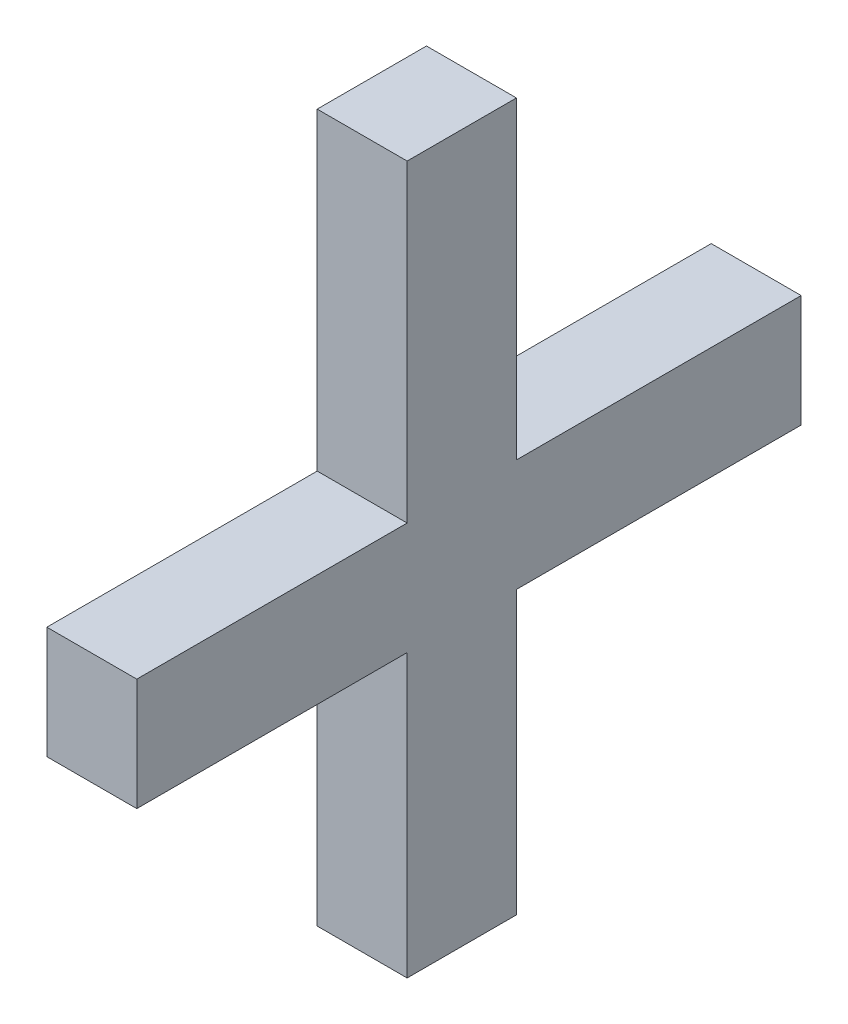
ISO-10303-21;
HEADER;
FILE_DESCRIPTION(('STEP AP214'),'2;1');
FILE_NAME('part.step','',(''),(''),'','','');
FILE_SCHEMA(('AUTOMOTIVE_DESIGN { 1 0 10303 214 1 1 1 1 }'));
ENDSEC;
DATA;
#1=APPLICATION_CONTEXT('core data for automotive mechanical design processes');
#2=APPLICATION_PROTOCOL_DEFINITION('international standard','automotive_design',2000,#1);
#3=PRODUCT_CONTEXT('',#1,'mechanical');
#4=PRODUCT('Part','Part','',(#3));
#5=PRODUCT_RELATED_PRODUCT_CATEGORY('part','',(#4));
#6=PRODUCT_DEFINITION_FORMATION('','',#4);
#7=PRODUCT_DEFINITION_CONTEXT('part definition',#1,'design');
#8=PRODUCT_DEFINITION('design','',#6,#7);
#9=PRODUCT_DEFINITION_SHAPE('','',#8);
#10=(LENGTH_UNIT() NAMED_UNIT(*) SI_UNIT(.MILLI.,.METRE.));
#11=(NAMED_UNIT(*) PLANE_ANGLE_UNIT() SI_UNIT($,.RADIAN.));
#12=(NAMED_UNIT(*) SI_UNIT($,.STERADIAN.) SOLID_ANGLE_UNIT());
#13=UNCERTAINTY_MEASURE_WITH_UNIT(LENGTH_MEASURE(1.E-05),#10,'distance_accuracy_value','');
#14=(GEOMETRIC_REPRESENTATION_CONTEXT(3) GLOBAL_UNCERTAINTY_ASSIGNED_CONTEXT((#13)) GLOBAL_UNIT_ASSIGNED_CONTEXT((#10,
#11,#12)) REPRESENTATION_CONTEXT('',''));
#15=CARTESIAN_POINT('',(0.,0.,0.));
#16=DIRECTION('',(0.,0.,1.));
#17=DIRECTION('',(1.,0.,0.));
#18=AXIS2_PLACEMENT_3D('',#15,#16,#17);
#19=CARTESIAN_POINT('',(20.25,12.25,-20.25));
#20=DIRECTION('',(-1.,0.,0.));
#21=DIRECTION('',(0.,0.,1.));
#22=AXIS2_PLACEMENT_3D('',#19,#20,#21);
#23=PLANE('',#22);
#24=DIRECTION('',(0.,0.,1.));
#25=VECTOR('',#24,1.);
#26=CARTESIAN_POINT('',(20.25,14.1090192240258,0.));
#27=LINE('',#26,#25);
#28=CARTESIAN_POINT('',(20.25,14.1090192240258,-18.0636481272001));
#29=VERTEX_POINT('',#28);
#30=CARTESIAN_POINT('',(20.25,14.1090192240258,-17.3123076946756));
#31=VERTEX_POINT('',#30);
#32=EDGE_CURVE('E242',#29,#31,#27,.T.);
#33=ORIENTED_EDGE('',*,*,#32,.T.);
#34=DIRECTION('',(0.,-1.,0.));
#35=VECTOR('',#34,1.);
#36=CARTESIAN_POINT('',(20.25,22.05,-17.3123076946756));
#37=LINE('',#36,#35);
#38=CARTESIAN_POINT('',(20.25,13.7972928743614,-17.3123076946756));
#39=VERTEX_POINT('',#38);
#40=EDGE_CURVE('E54',#31,#39,#37,.T.);
#41=ORIENTED_EDGE('',*,*,#40,.T.);
#42=DIRECTION('',(0.,0.,1.));
#43=VECTOR('',#42,1.);
#44=CARTESIAN_POINT('',(20.25,13.7972928743614,0.));
#45=LINE('',#44,#43);
#46=CARTESIAN_POINT('',(20.25,13.7972928743614,-18.0636481272001));
#47=VERTEX_POINT('',#46);
#48=EDGE_CURVE('E185',#47,#39,#45,.T.);
#49=ORIENTED_EDGE('',*,*,#48,.F.);
#50=DIRECTION('',(0.,1.,0.));
#51=VECTOR('',#50,1.);
#52=CARTESIAN_POINT('',(20.25,22.05,-18.0636481272001));
#53=LINE('',#52,#51);
#54=CARTESIAN_POINT('',(20.25,13.0139805085379,-18.0636481272001));
#55=VERTEX_POINT('',#54);
#56=EDGE_CURVE('E289',#55,#47,#53,.T.);
#57=ORIENTED_EDGE('',*,*,#56,.F.);
#58=DIRECTION('',(0.,0.,1.));
#59=VECTOR('',#58,1.);
#60=CARTESIAN_POINT('',(20.25,13.0139805085379,0.));
#61=LINE('',#60,#59);
#62=CARTESIAN_POINT('',(20.25,13.0139805085379,-18.3673814935398));
#63=VERTEX_POINT('',#62);
#64=EDGE_CURVE('E287',#63,#55,#61,.T.);
#65=ORIENTED_EDGE('',*,*,#64,.F.);
#66=DIRECTION('',(0.,1.,0.));
#67=VECTOR('',#66,1.);
#68=CARTESIAN_POINT('',(20.25,22.05,-18.3673814935398));
#69=LINE('',#68,#67);
#70=CARTESIAN_POINT('',(20.25,13.7972928743614,-18.3673814935398));
#71=VERTEX_POINT('',#70);
#72=EDGE_CURVE('E256',#63,#71,#69,.T.);
#73=ORIENTED_EDGE('',*,*,#72,.T.);
#74=DIRECTION('',(0.,0.,1.));
#75=VECTOR('',#74,1.);
#76=CARTESIAN_POINT('',(20.25,13.7972928743614,0.));
#77=LINE('',#76,#75);
#78=CARTESIAN_POINT('',(20.25,13.7972928743614,-19.1586868426881));
#79=VERTEX_POINT('',#78);
#80=EDGE_CURVE('E290',#79,#71,#77,.T.);
#81=ORIENTED_EDGE('',*,*,#80,.F.);
#82=DIRECTION('',(0.,-1.,0.));
#83=VECTOR('',#82,1.);
#84=CARTESIAN_POINT('',(20.25,22.05,-19.1586868426881));
#85=LINE('',#84,#83);
#86=CARTESIAN_POINT('',(20.25,14.1090192240258,-19.1586868426881));
#87=VERTEX_POINT('',#86);
#88=EDGE_CURVE('E300',#87,#79,#85,.T.);
#89=ORIENTED_EDGE('',*,*,#88,.F.);
#90=DIRECTION('',(0.,0.,1.));
#91=VECTOR('',#90,1.);
#92=CARTESIAN_POINT('',(20.25,14.1090192240258,0.));
#93=LINE('',#92,#91);
#94=CARTESIAN_POINT('',(20.25,14.1090192240258,-18.3673814935398));
#95=VERTEX_POINT('',#94);
#96=EDGE_CURVE('E167',#87,#95,#93,.T.);
#97=ORIENTED_EDGE('',*,*,#96,.T.);
#98=DIRECTION('',(0.,1.,0.));
#99=VECTOR('',#98,1.);
#100=CARTESIAN_POINT('',(20.25,22.05,-18.3673814935398));
#101=LINE('',#100,#99);
#102=CARTESIAN_POINT('',(20.25,14.9802544064213,-18.3673814935398));
#103=VERTEX_POINT('',#102);
#104=EDGE_CURVE('E251',#95,#103,#101,.T.);
#105=ORIENTED_EDGE('',*,*,#104,.T.);
#106=DIRECTION('',(0.,0.,1.));
#107=VECTOR('',#106,1.);
#108=CARTESIAN_POINT('',(20.25,14.9802544064213,0.));
#109=LINE('',#108,#107);
#110=CARTESIAN_POINT('',(20.25,14.9802544064213,-18.0636481272001));
#111=VERTEX_POINT('',#110);
#112=EDGE_CURVE('E247',#103,#111,#109,.T.);
#113=ORIENTED_EDGE('',*,*,#112,.T.);
#114=DIRECTION('',(0.,1.,0.));
#115=VECTOR('',#114,1.);
#116=CARTESIAN_POINT('',(20.25,22.05,-18.0636481272001));
#117=LINE('',#116,#115);
#118=EDGE_CURVE('E246',#29,#111,#117,.T.);
#119=ORIENTED_EDGE('',*,*,#118,.F.);
#120=EDGE_LOOP('',(#33,#41,#49,#57,#65,#73,#81,#89,#97,#105,#113,#119));
#121=FACE_BOUND('',#120,.T.);
#122=ADVANCED_FACE('F51',(#121),#23,.F.);
#123=CARTESIAN_POINT('',(20.,22.05,-17.3123076946756));
#124=DIRECTION('',(0.,0.,1.));
#125=DIRECTION('',(-1.,0.,0.));
#126=AXIS2_PLACEMENT_3D('',#123,#124,#125);
#127=PLANE('',#126);
#128=ORIENTED_EDGE('',*,*,#40,.F.);
#129=DIRECTION('',(1.,0.,0.));
#130=VECTOR('',#129,1.);
#131=CARTESIAN_POINT('',(20.,14.1090192240258,-17.3123076946756));
#132=LINE('',#131,#130);
#133=CARTESIAN_POINT('',(20.,14.1090192240258,-17.3123076946756));
#134=VERTEX_POINT('',#133);
#135=EDGE_CURVE('E60',#134,#31,#132,.T.);
#136=ORIENTED_EDGE('',*,*,#135,.F.);
#137=DIRECTION('',(0.,-1.,0.));
#138=VECTOR('',#137,1.);
#139=CARTESIAN_POINT('',(20.,22.05,-17.3123076946756));
#140=LINE('',#139,#138);
#141=CARTESIAN_POINT('',(20.,13.7972928743614,-17.3123076946756));
#142=VERTEX_POINT('',#141);
#143=EDGE_CURVE('E82',#134,#142,#140,.T.);
#144=ORIENTED_EDGE('',*,*,#143,.T.);
#145=DIRECTION('',(1.,0.,0.));
#146=VECTOR('',#145,1.);
#147=CARTESIAN_POINT('',(20.,13.7972928743614,-17.3123076946756));
#148=LINE('',#147,#146);
#149=EDGE_CURVE('E213',#142,#39,#148,.T.);
#150=ORIENTED_EDGE('',*,*,#149,.T.);
#151=EDGE_LOOP('',(#128,#136,#144,#150));
#152=FACE_BOUND('',#151,.T.);
#153=ADVANCED_FACE('F275',(#152),#127,.T.);
#154=CARTESIAN_POINT('',(20.,13.7972928743614,0.));
#155=DIRECTION('',(0.,1.,0.));
#156=DIRECTION('',(1.,0.,0.));
#157=AXIS2_PLACEMENT_3D('',#154,#155,#156);
#158=PLANE('',#157);
#159=ORIENTED_EDGE('',*,*,#48,.T.);
#160=ORIENTED_EDGE('',*,*,#149,.F.);
#161=DIRECTION('',(0.,0.,1.));
#162=VECTOR('',#161,1.);
#163=CARTESIAN_POINT('',(20.,13.7972928743614,0.));
#164=LINE('',#163,#162);
#165=CARTESIAN_POINT('',(20.,13.7972928743614,-18.0636481272001));
#166=VERTEX_POINT('',#165);
#167=EDGE_CURVE('E209',#166,#142,#164,.T.);
#168=ORIENTED_EDGE('',*,*,#167,.F.);
#169=DIRECTION('',(1.,0.,0.));
#170=VECTOR('',#169,1.);
#171=CARTESIAN_POINT('',(20.,13.7972928743614,-18.0636481272001));
#172=LINE('',#171,#170);
#173=EDGE_CURVE('E207',#166,#47,#172,.T.);
#174=ORIENTED_EDGE('',*,*,#173,.T.);
#175=EDGE_LOOP('',(#159,#160,#168,#174));
#176=FACE_BOUND('',#175,.T.);
#177=ADVANCED_FACE('F277',(#176),#158,.F.);
#178=CARTESIAN_POINT('',(20.,22.05,-18.0636481272001));
#179=DIRECTION('',(0.,0.,-1.));
#180=DIRECTION('',(0.,-1.,0.));
#181=AXIS2_PLACEMENT_3D('',#178,#179,#180);
#182=PLANE('',#181);
#183=ORIENTED_EDGE('',*,*,#56,.T.);
#184=ORIENTED_EDGE('',*,*,#173,.F.);
#185=DIRECTION('',(0.,1.,0.));
#186=VECTOR('',#185,1.);
#187=CARTESIAN_POINT('',(20.,22.05,-18.0636481272001));
#188=LINE('',#187,#186);
#189=CARTESIAN_POINT('',(20.,13.0139805085379,-18.0636481272001));
#190=VERTEX_POINT('',#189);
#191=EDGE_CURVE('E203',#190,#166,#188,.T.);
#192=ORIENTED_EDGE('',*,*,#191,.F.);
#193=DIRECTION('',(1.,0.,0.));
#194=VECTOR('',#193,1.);
#195=CARTESIAN_POINT('',(20.,13.0139805085379,-18.0636481272001));
#196=LINE('',#195,#194);
#197=EDGE_CURVE('E208',#190,#55,#196,.T.);
#198=ORIENTED_EDGE('',*,*,#197,.T.);
#199=EDGE_LOOP('',(#183,#184,#192,#198));
#200=FACE_BOUND('',#199,.T.);
#201=ADVANCED_FACE('F283',(#200),#182,.F.);
#202=CARTESIAN_POINT('',(20.,13.0139805085379,0.));
#203=DIRECTION('',(0.,1.,0.));
#204=DIRECTION('',(1.,0.,0.));
#205=AXIS2_PLACEMENT_3D('',#202,#203,#204);
#206=PLANE('',#205);
#207=ORIENTED_EDGE('',*,*,#64,.T.);
#208=ORIENTED_EDGE('',*,*,#197,.F.);
#209=DIRECTION('',(0.,0.,1.));
#210=VECTOR('',#209,1.);
#211=CARTESIAN_POINT('',(20.,13.0139805085379,0.));
#212=LINE('',#211,#210);
#213=CARTESIAN_POINT('',(20.,13.0139805085379,-18.3673814935398));
#214=VERTEX_POINT('',#213);
#215=EDGE_CURVE('E232',#214,#190,#212,.T.);
#216=ORIENTED_EDGE('',*,*,#215,.F.);
#217=DIRECTION('',(1.,0.,0.));
#218=VECTOR('',#217,1.);
#219=CARTESIAN_POINT('',(20.,13.0139805085379,-18.3673814935398));
#220=LINE('',#219,#218);
#221=EDGE_CURVE('E201',#214,#63,#220,.T.);
#222=ORIENTED_EDGE('',*,*,#221,.T.);
#223=EDGE_LOOP('',(#207,#208,#216,#222));
#224=FACE_BOUND('',#223,.T.);
#225=ADVANCED_FACE('F285',(#224),#206,.F.);
#226=CARTESIAN_POINT('',(20.,22.05,-18.3673814935398));
#227=DIRECTION('',(0.,0.,-1.));
#228=DIRECTION('',(0.,-1.,0.));
#229=AXIS2_PLACEMENT_3D('',#226,#227,#228);
#230=PLANE('',#229);
#231=ORIENTED_EDGE('',*,*,#72,.F.);
#232=ORIENTED_EDGE('',*,*,#221,.F.);
#233=DIRECTION('',(0.,1.,0.));
#234=VECTOR('',#233,1.);
#235=CARTESIAN_POINT('',(20.,22.05,-18.3673814935398));
#236=LINE('',#235,#234);
#237=CARTESIAN_POINT('',(20.,13.7972928743614,-18.3673814935398));
#238=VERTEX_POINT('',#237);
#239=EDGE_CURVE('E198',#214,#238,#236,.T.);
#240=ORIENTED_EDGE('',*,*,#239,.T.);
#241=DIRECTION('',(1.,0.,0.));
#242=VECTOR('',#241,1.);
#243=CARTESIAN_POINT('',(20.,13.7972928743614,-18.3673814935398));
#244=LINE('',#243,#242);
#245=EDGE_CURVE('E202',#238,#71,#244,.T.);
#246=ORIENTED_EDGE('',*,*,#245,.T.);
#247=EDGE_LOOP('',(#231,#232,#240,#246));
#248=FACE_BOUND('',#247,.T.);
#249=ADVANCED_FACE('F318',(#248),#230,.T.);
#250=CARTESIAN_POINT('',(20.,13.7972928743614,0.));
#251=DIRECTION('',(0.,1.,0.));
#252=DIRECTION('',(1.,0.,0.));
#253=AXIS2_PLACEMENT_3D('',#250,#251,#252);
#254=PLANE('',#253);
#255=ORIENTED_EDGE('',*,*,#80,.T.);
#256=ORIENTED_EDGE('',*,*,#245,.F.);
#257=DIRECTION('',(0.,0.,1.));
#258=VECTOR('',#257,1.);
#259=CARTESIAN_POINT('',(20.,13.7972928743614,0.));
#260=LINE('',#259,#258);
#261=CARTESIAN_POINT('',(20.,13.7972928743614,-19.1586868426881));
#262=VERTEX_POINT('',#261);
#263=EDGE_CURVE('E197',#262,#238,#260,.T.);
#264=ORIENTED_EDGE('',*,*,#263,.F.);
#265=DIRECTION('',(1.,0.,0.));
#266=VECTOR('',#265,1.);
#267=CARTESIAN_POINT('',(20.,13.7972928743614,-19.1586868426881));
#268=LINE('',#267,#266);
#269=EDGE_CURVE('E155',#262,#79,#268,.T.);
#270=ORIENTED_EDGE('',*,*,#269,.T.);
#271=EDGE_LOOP('',(#255,#256,#264,#270));
#272=FACE_BOUND('',#271,.T.);
#273=ADVANCED_FACE('F316',(#272),#254,.F.);
#274=CARTESIAN_POINT('',(20.,22.05,-19.1586868426881));
#275=DIRECTION('',(0.,0.,1.));
#276=DIRECTION('',(-1.,0.,0.));
#277=AXIS2_PLACEMENT_3D('',#274,#275,#276);
#278=PLANE('',#277);
#279=ORIENTED_EDGE('',*,*,#88,.T.);
#280=ORIENTED_EDGE('',*,*,#269,.F.);
#281=DIRECTION('',(0.,-1.,0.));
#282=VECTOR('',#281,1.);
#283=CARTESIAN_POINT('',(20.,22.05,-19.1586868426881));
#284=LINE('',#283,#282);
#285=CARTESIAN_POINT('',(20.,14.1090192240258,-19.1586868426881));
#286=VERTEX_POINT('',#285);
#287=EDGE_CURVE('E150',#286,#262,#284,.T.);
#288=ORIENTED_EDGE('',*,*,#287,.F.);
#289=DIRECTION('',(1.,0.,0.));
#290=VECTOR('',#289,1.);
#291=CARTESIAN_POINT('',(20.,14.1090192240258,-19.1586868426881));
#292=LINE('',#291,#290);
#293=EDGE_CURVE('E153',#286,#87,#292,.T.);
#294=ORIENTED_EDGE('',*,*,#293,.T.);
#295=EDGE_LOOP('',(#279,#280,#288,#294));
#296=FACE_BOUND('',#295,.T.);
#297=ADVANCED_FACE('F152',(#296),#278,.F.);
#298=CARTESIAN_POINT('',(20.,14.1090192240258,0.));
#299=DIRECTION('',(0.,1.,0.));
#300=DIRECTION('',(1.,0.,0.));
#301=AXIS2_PLACEMENT_3D('',#298,#299,#300);
#302=PLANE('',#301);
#303=ORIENTED_EDGE('',*,*,#96,.F.);
#304=ORIENTED_EDGE('',*,*,#293,.F.);
#305=DIRECTION('',(0.,0.,1.));
#306=VECTOR('',#305,1.);
#307=CARTESIAN_POINT('',(20.,14.1090192240258,0.));
#308=LINE('',#307,#306);
#309=CARTESIAN_POINT('',(20.,14.1090192240258,-18.3673814935398));
#310=VERTEX_POINT('',#309);
#311=EDGE_CURVE('E164',#286,#310,#308,.T.);
#312=ORIENTED_EDGE('',*,*,#311,.T.);
#313=DIRECTION('',(1.,0.,0.));
#314=VECTOR('',#313,1.);
#315=CARTESIAN_POINT('',(20.,14.1090192240258,-18.3673814935398));
#316=LINE('',#315,#314);
#317=EDGE_CURVE('E177',#310,#95,#316,.T.);
#318=ORIENTED_EDGE('',*,*,#317,.T.);
#319=EDGE_LOOP('',(#303,#304,#312,#318));
#320=FACE_BOUND('',#319,.T.);
#321=ADVANCED_FACE('F162',(#320),#302,.T.);
#322=CARTESIAN_POINT('',(20.,22.05,-18.3673814935398));
#323=DIRECTION('',(0.,0.,-1.));
#324=DIRECTION('',(0.,-1.,0.));
#325=AXIS2_PLACEMENT_3D('',#322,#323,#324);
#326=PLANE('',#325);
#327=ORIENTED_EDGE('',*,*,#104,.F.);
#328=ORIENTED_EDGE('',*,*,#317,.F.);
#329=DIRECTION('',(0.,1.,0.));
#330=VECTOR('',#329,1.);
#331=CARTESIAN_POINT('',(20.,22.05,-18.3673814935398));
#332=LINE('',#331,#330);
#333=CARTESIAN_POINT('',(20.,14.9802544064213,-18.3673814935398));
#334=VERTEX_POINT('',#333);
#335=EDGE_CURVE('E175',#310,#334,#332,.T.);
#336=ORIENTED_EDGE('',*,*,#335,.T.);
#337=DIRECTION('',(1.,0.,0.));
#338=VECTOR('',#337,1.);
#339=CARTESIAN_POINT('',(20.,14.9802544064213,-18.3673814935398));
#340=LINE('',#339,#338);
#341=EDGE_CURVE('E190',#334,#103,#340,.T.);
#342=ORIENTED_EDGE('',*,*,#341,.T.);
#343=EDGE_LOOP('',(#327,#328,#336,#342));
#344=FACE_BOUND('',#343,.T.);
#345=ADVANCED_FACE('F512',(#344),#326,.T.);
#346=CARTESIAN_POINT('',(20.,14.1090192240258,0.));
#347=DIRECTION('',(0.,1.,0.));
#348=DIRECTION('',(1.,0.,0.));
#349=AXIS2_PLACEMENT_3D('',#346,#347,#348);
#350=PLANE('',#349);
#351=ORIENTED_EDGE('',*,*,#32,.F.);
#352=DIRECTION('',(1.,0.,0.));
#353=VECTOR('',#352,1.);
#354=CARTESIAN_POINT('',(20.,14.1090192240258,-18.0636481272001));
#355=LINE('',#354,#353);
#356=CARTESIAN_POINT('',(20.,14.1090192240258,-18.0636481272001));
#357=VERTEX_POINT('',#356);
#358=EDGE_CURVE('E214',#357,#29,#355,.T.);
#359=ORIENTED_EDGE('',*,*,#358,.F.);
#360=DIRECTION('',(0.,0.,1.));
#361=VECTOR('',#360,1.);
#362=CARTESIAN_POINT('',(20.,14.1090192240258,0.));
#363=LINE('',#362,#361);
#364=EDGE_CURVE('E11',#357,#134,#363,.T.);
#365=ORIENTED_EDGE('',*,*,#364,.T.);
#366=ORIENTED_EDGE('',*,*,#135,.T.);
#367=EDGE_LOOP('',(#351,#359,#365,#366));
#368=FACE_BOUND('',#367,.T.);
#369=ADVANCED_FACE('F501',(#368),#350,.T.);
#370=CARTESIAN_POINT('',(20.,22.05,0.));
#371=DIRECTION('',(1.,0.,0.));
#372=DIRECTION('',(0.,1.,0.));
#373=AXIS2_PLACEMENT_3D('',#370,#371,#372);
#374=PLANE('',#373);
#375=DIRECTION('',(0.,1.,0.));
#376=VECTOR('',#375,1.);
#377=CARTESIAN_POINT('',(20.,22.05,-18.0636481272001));
#378=LINE('',#377,#376);
#379=CARTESIAN_POINT('',(20.,14.9802544064213,-18.0636481272001));
#380=VERTEX_POINT('',#379);
#381=EDGE_CURVE('E218',#357,#380,#378,.T.);
#382=ORIENTED_EDGE('',*,*,#381,.T.);
#383=DIRECTION('',(0.,0.,1.));
#384=VECTOR('',#383,1.);
#385=CARTESIAN_POINT('',(20.,14.9802544064213,0.));
#386=LINE('',#385,#384);
#387=EDGE_CURVE('E187',#334,#380,#386,.T.);
#388=ORIENTED_EDGE('',*,*,#387,.F.);
#389=ORIENTED_EDGE('',*,*,#335,.F.);
#390=ORIENTED_EDGE('',*,*,#311,.F.);
#391=ORIENTED_EDGE('',*,*,#287,.T.);
#392=ORIENTED_EDGE('',*,*,#263,.T.);
#393=ORIENTED_EDGE('',*,*,#239,.F.);
#394=ORIENTED_EDGE('',*,*,#215,.T.);
#395=ORIENTED_EDGE('',*,*,#191,.T.);
#396=ORIENTED_EDGE('',*,*,#167,.T.);
#397=ORIENTED_EDGE('',*,*,#143,.F.);
#398=ORIENTED_EDGE('',*,*,#364,.F.);
#399=EDGE_LOOP('',(#382,#388,#389,#390,#391,#392,#393,#394,#395,#396,#397,#398));
#400=FACE_BOUND('',#399,.T.);
#401=ADVANCED_FACE('F173',(#400),#374,.F.);
#402=CARTESIAN_POINT('',(20.,14.9802544064213,0.));
#403=DIRECTION('',(0.,1.,0.));
#404=DIRECTION('',(1.,0.,0.));
#405=AXIS2_PLACEMENT_3D('',#402,#403,#404);
#406=PLANE('',#405);
#407=ORIENTED_EDGE('',*,*,#112,.F.);
#408=ORIENTED_EDGE('',*,*,#341,.F.);
#409=ORIENTED_EDGE('',*,*,#387,.T.);
#410=DIRECTION('',(1.,0.,0.));
#411=VECTOR('',#410,1.);
#412=CARTESIAN_POINT('',(20.,14.9802544064213,-18.0636481272001));
#413=LINE('',#412,#411);
#414=EDGE_CURVE('E191',#380,#111,#413,.T.);
#415=ORIENTED_EDGE('',*,*,#414,.T.);
#416=EDGE_LOOP('',(#407,#408,#409,#415));
#417=FACE_BOUND('',#416,.T.);
#418=ADVANCED_FACE('F478',(#417),#406,.T.);
#419=CARTESIAN_POINT('',(20.,22.05,-18.0636481272001));
#420=DIRECTION('',(0.,0.,-1.));
#421=DIRECTION('',(0.,-1.,0.));
#422=AXIS2_PLACEMENT_3D('',#419,#420,#421);
#423=PLANE('',#422);
#424=ORIENTED_EDGE('',*,*,#118,.T.);
#425=ORIENTED_EDGE('',*,*,#414,.F.);
#426=ORIENTED_EDGE('',*,*,#381,.F.);
#427=ORIENTED_EDGE('',*,*,#358,.T.);
#428=EDGE_LOOP('',(#424,#425,#426,#427));
#429=FACE_BOUND('',#428,.T.);
#430=ADVANCED_FACE('F473',(#429),#423,.F.);
#431=CLOSED_SHELL('',(#122,#153,#177,#201,#225,#249,#273,#297,#321,#345,#369,#401,#418,#430));
#432=MANIFOLD_SOLID_BREP('B2',#431);
#433=ADVANCED_BREP_SHAPE_REPRESENTATION('',(#18,#432),#14);
#434=SHAPE_DEFINITION_REPRESENTATION(#9,#433);
ENDSEC;
END-ISO-10303-21;
